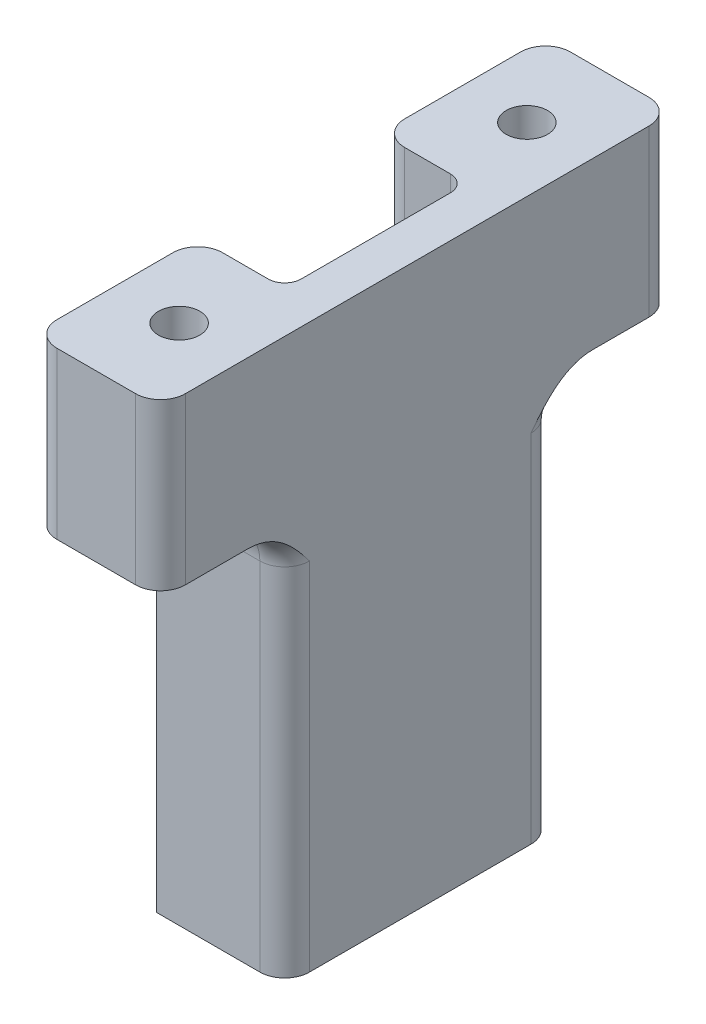
ISO-10303-21;
HEADER;
FILE_DESCRIPTION(('STEP AP214'),'2;1');
FILE_NAME('part.step','',(''),(''),'','','');
FILE_SCHEMA(('AUTOMOTIVE_DESIGN { 1 0 10303 214 1 1 1 1 }'));
ENDSEC;
DATA;
#1=APPLICATION_CONTEXT('core data for automotive mechanical design processes');
#2=APPLICATION_PROTOCOL_DEFINITION('international standard','automotive_design',2000,#1);
#3=PRODUCT_CONTEXT('',#1,'mechanical');
#4=PRODUCT('Part','Part','',(#3));
#5=PRODUCT_RELATED_PRODUCT_CATEGORY('part','',(#4));
#6=PRODUCT_DEFINITION_FORMATION('','',#4);
#7=PRODUCT_DEFINITION_CONTEXT('part definition',#1,'design');
#8=PRODUCT_DEFINITION('design','',#6,#7);
#9=PRODUCT_DEFINITION_SHAPE('','',#8);
#10=(LENGTH_UNIT() NAMED_UNIT(*) SI_UNIT(.MILLI.,.METRE.));
#11=(NAMED_UNIT(*) PLANE_ANGLE_UNIT() SI_UNIT($,.RADIAN.));
#12=(NAMED_UNIT(*) SI_UNIT($,.STERADIAN.) SOLID_ANGLE_UNIT());
#13=UNCERTAINTY_MEASURE_WITH_UNIT(LENGTH_MEASURE(1.E-05),#10,'distance_accuracy_value','');
#14=(GEOMETRIC_REPRESENTATION_CONTEXT(3) GLOBAL_UNCERTAINTY_ASSIGNED_CONTEXT((#13)) GLOBAL_UNIT_ASSIGNED_CONTEXT((#10,
#11,#12)) REPRESENTATION_CONTEXT('',''));
#15=CARTESIAN_POINT('',(0.,0.,0.));
#16=DIRECTION('',(0.,0.,1.));
#17=DIRECTION('',(1.,0.,0.));
#18=AXIS2_PLACEMENT_3D('',#15,#16,#17);
#19=CARTESIAN_POINT('',(0.,0.,0.));
#20=DIRECTION('',(0.,-1.,0.));
#21=DIRECTION('',(0.,0.,-1.));
#22=AXIS2_PLACEMENT_3D('',#19,#20,#21);
#23=PLANE('',#22);
#24=CARTESIAN_POINT('',(-0.380000000000774,0.,-20.6299999999947));
#25=DIRECTION('',(0.,1.,0.));
#26=DIRECTION('',(0.,0.,1.));
#27=AXIS2_PLACEMENT_3D('',#24,#25,#26);
#28=CIRCLE('',#27,2.49999999999999);
#29=CARTESIAN_POINT('',(-0.380000000000774,0.,-18.1299999999947));
#30=VERTEX_POINT('',#29);
#31=EDGE_CURVE('E233',#30,#30,#28,.T.);
#32=ORIENTED_EDGE('',*,*,#31,.F.);
#33=EDGE_LOOP('',(#32));
#34=FACE_BOUND('',#33,.T.);
#35=DIRECTION('',(0.,0.,1.));
#36=VECTOR('',#35,1.);
#37=CARTESIAN_POINT('',(-8.13000000000111,0.,31.370000000004));
#38=LINE('',#37,#36);
#39=CARTESIAN_POINT('',(-8.13000000000111,0.,-27.6299999999959));
#40=VERTEX_POINT('',#39);
#41=CARTESIAN_POINT('',(-8.13000000000055,0.,-13.6299999999935));
#42=VERTEX_POINT('',#41);
#43=EDGE_CURVE('E362',#40,#42,#38,.T.);
#44=ORIENTED_EDGE('',*,*,#43,.T.);
#45=CARTESIAN_POINT('',(-5.13000000000055,0.,-13.6299999999935));
#46=DIRECTION('',(0.,-1.,0.));
#47=DIRECTION('',(0.,0.,1.));
#48=AXIS2_PLACEMENT_3D('',#45,#46,#47);
#49=CIRCLE('',#48,3.);
#50=CARTESIAN_POINT('',(-5.13000000000055,0.,-10.6299999999935));
#51=VERTEX_POINT('',#50);
#52=EDGE_CURVE('E310',#51,#42,#49,.T.);
#53=ORIENTED_EDGE('',*,*,#52,.F.);
#54=DIRECTION('',(-1.,0.,0.));
#55=VECTOR('',#54,1.);
#56=CARTESIAN_POINT('',(-5.13000000000055,0.,-10.6299999999935));
#57=LINE('',#56,#55);
#58=CARTESIAN_POINT('',(0.369999999999482,0.,-10.6299999999936));
#59=VERTEX_POINT('',#58);
#60=EDGE_CURVE('E327',#59,#51,#57,.T.);
#61=ORIENTED_EDGE('',*,*,#60,.F.);
#62=CARTESIAN_POINT('',(0.36999999999951,0.,-8.62999999999356));
#63=DIRECTION('',(0.,1.,0.));
#64=DIRECTION('',(0.,0.,1.));
#65=AXIS2_PLACEMENT_3D('',#62,#63,#64);
#66=CIRCLE('',#65,2.);
#67=CARTESIAN_POINT('',(2.36999999999951,0.,-8.62999999999358));
#68=VERTEX_POINT('',#67);
#69=EDGE_CURVE('E324',#68,#59,#66,.T.);
#70=ORIENTED_EDGE('',*,*,#69,.F.);
#71=DIRECTION('',(0.,0.,-1.));
#72=VECTOR('',#71,1.);
#73=CARTESIAN_POINT('',(2.36999999999951,0.,-8.62999999999358));
#74=LINE('',#73,#72);
#75=CARTESIAN_POINT('',(2.36999999999971,0.,9.37000000000642));
#76=VERTEX_POINT('',#75);
#77=EDGE_CURVE('E321',#76,#68,#74,.T.);
#78=ORIENTED_EDGE('',*,*,#77,.F.);
#79=CARTESIAN_POINT('',(0.369999999999704,0.,9.37000000000644));
#80=DIRECTION('',(0.,1.,0.));
#81=DIRECTION('',(0.,0.,1.));
#82=AXIS2_PLACEMENT_3D('',#79,#80,#81);
#83=CIRCLE('',#82,2.);
#84=CARTESIAN_POINT('',(0.369999999999704,0.,11.3700000000064));
#85=VERTEX_POINT('',#84);
#86=EDGE_CURVE('E318',#85,#76,#83,.T.);
#87=ORIENTED_EDGE('',*,*,#86,.F.);
#88=DIRECTION('',(1.,0.,0.));
#89=VECTOR('',#88,1.);
#90=CARTESIAN_POINT('',(0.369999999999704,0.,11.3700000000064));
#91=LINE('',#90,#89);
#92=CARTESIAN_POINT('',(-5.1300000000003,0.,11.3700000000065));
#93=VERTEX_POINT('',#92);
#94=EDGE_CURVE('E315',#93,#85,#91,.T.);
#95=ORIENTED_EDGE('',*,*,#94,.F.);
#96=CARTESIAN_POINT('',(-5.13000000000027,0.,14.3700000000065));
#97=DIRECTION('',(0.,-1.,0.));
#98=DIRECTION('',(0.,0.,1.));
#99=AXIS2_PLACEMENT_3D('',#96,#97,#98);
#100=CIRCLE('',#99,3.);
#101=CARTESIAN_POINT('',(-8.13000000000111,0.,14.3700000000065));
#102=VERTEX_POINT('',#101);
#103=EDGE_CURVE('E312',#102,#93,#100,.T.);
#104=ORIENTED_EDGE('',*,*,#103,.F.);
#105=CARTESIAN_POINT('',(-8.13000000000111,0.,28.370000000004));
#106=VERTEX_POINT('',#105);
#107=EDGE_CURVE('E361',#102,#106,#38,.T.);
#108=ORIENTED_EDGE('',*,*,#107,.T.);
#109=CARTESIAN_POINT('',(-5.13000000000111,0.,28.370000000004));
#110=DIRECTION('',(0.,-1.,0.));
#111=DIRECTION('',(0.,0.,-1.));
#112=AXIS2_PLACEMENT_3D('',#109,#110,#111);
#113=CIRCLE('',#112,3.);
#114=CARTESIAN_POINT('',(-5.13000000000111,0.,31.370000000004));
#115=VERTEX_POINT('',#114);
#116=EDGE_CURVE('E373',#106,#115,#113,.F.);
#117=ORIENTED_EDGE('',*,*,#116,.T.);
#118=DIRECTION('',(1.,0.,0.));
#119=VECTOR('',#118,1.);
#120=CARTESIAN_POINT('',(-8.13000000000111,0.,31.370000000004));
#121=LINE('',#120,#119);
#122=CARTESIAN_POINT('',(4.36999999999956,0.,31.370000000004));
#123=VERTEX_POINT('',#122);
#124=EDGE_CURVE('E352',#115,#123,#121,.T.);
#125=ORIENTED_EDGE('',*,*,#124,.T.);
#126=CARTESIAN_POINT('',(4.36999999999956,0.,28.370000000004));
#127=DIRECTION('',(0.,-1.,0.));
#128=DIRECTION('',(0.,0.,-1.));
#129=AXIS2_PLACEMENT_3D('',#126,#127,#128);
#130=CIRCLE('',#129,3.);
#131=CARTESIAN_POINT('',(7.36999999999956,0.,28.370000000004));
#132=VERTEX_POINT('',#131);
#133=EDGE_CURVE('E371',#123,#132,#130,.F.);
#134=ORIENTED_EDGE('',*,*,#133,.T.);
#135=DIRECTION('',(0.,0.,-1.));
#136=VECTOR('',#135,1.);
#137=CARTESIAN_POINT('',(7.36999999999956,0.,31.370000000004));
#138=LINE('',#137,#136);
#139=CARTESIAN_POINT('',(7.36999999999956,0.,-27.6299999999959));
#140=VERTEX_POINT('',#139);
#141=EDGE_CURVE('E333',#132,#140,#138,.T.);
#142=ORIENTED_EDGE('',*,*,#141,.T.);
#143=CARTESIAN_POINT('',(4.36999999999956,0.,-27.6299999999959));
#144=DIRECTION('',(0.,-1.,0.));
#145=DIRECTION('',(0.,0.,-1.));
#146=AXIS2_PLACEMENT_3D('',#143,#144,#145);
#147=CIRCLE('',#146,3.);
#148=CARTESIAN_POINT('',(4.36999999999956,0.,-30.6299999999959));
#149=VERTEX_POINT('',#148);
#150=EDGE_CURVE('E375',#140,#149,#147,.F.);
#151=ORIENTED_EDGE('',*,*,#150,.T.);
#152=DIRECTION('',(-1.,0.,0.));
#153=VECTOR('',#152,1.);
#154=CARTESIAN_POINT('',(-8.13000000000111,0.,-30.6299999999959));
#155=LINE('',#154,#153);
#156=CARTESIAN_POINT('',(-5.13000000000111,0.,-30.6299999999959));
#157=VERTEX_POINT('',#156);
#158=EDGE_CURVE('E358',#149,#157,#155,.T.);
#159=ORIENTED_EDGE('',*,*,#158,.T.);
#160=CARTESIAN_POINT('',(-5.13000000000111,0.,-27.6299999999959));
#161=DIRECTION('',(0.,-1.,0.));
#162=DIRECTION('',(0.,0.,-1.));
#163=AXIS2_PLACEMENT_3D('',#160,#161,#162);
#164=CIRCLE('',#163,3.);
#165=EDGE_CURVE('E377',#157,#40,#164,.F.);
#166=ORIENTED_EDGE('',*,*,#165,.T.);
#167=EDGE_LOOP('',(#44,#53,#61,#70,#78,#87,#95,#104,#108,#117,#125,#134,#142,#151,#159,#166));
#168=FACE_BOUND('',#167,.T.);
#169=CARTESIAN_POINT('',(-0.380000000000768,0.,21.3700000000052));
#170=DIRECTION('',(0.,1.,0.));
#171=DIRECTION('',(0.,0.,1.));
#172=AXIS2_PLACEMENT_3D('',#169,#170,#171);
#173=CIRCLE('',#172,2.49999999999999);
#174=CARTESIAN_POINT('',(-0.380000000000768,0.,23.8700000000052));
#175=VERTEX_POINT('',#174);
#176=EDGE_CURVE('E232',#175,#175,#173,.T.);
#177=ORIENTED_EDGE('',*,*,#176,.F.);
#178=EDGE_LOOP('',(#177));
#179=FACE_BOUND('',#178,.T.);
#180=ADVANCED_FACE('F49',(#34,#168,#179),#23,.F.);
#181=CARTESIAN_POINT('',(7.36999999999956,-68.,31.370000000004));
#182=DIRECTION('',(1.,0.,0.));
#183=DIRECTION('',(0.,0.,-1.));
#184=AXIS2_PLACEMENT_3D('',#181,#182,#183);
#185=PLANE('',#184);
#186=DIRECTION('',(0.,0.,-1.));
#187=VECTOR('',#186,1.);
#188=CARTESIAN_POINT('',(7.36999999999956,-68.,31.370000000004));
#189=LINE('',#188,#187);
#190=CARTESIAN_POINT('',(7.36999999999938,-68.,13.370000000004));
#191=VERTEX_POINT('',#190);
#192=CARTESIAN_POINT('',(7.36999999999938,-68.,-13.370000000004));
#193=VERTEX_POINT('',#192);
#194=EDGE_CURVE('E348',#191,#193,#189,.T.);
#195=ORIENTED_EDGE('',*,*,#194,.T.);
#196=DIRECTION('',(0.,-1.,0.));
#197=VECTOR('',#196,1.);
#198=CARTESIAN_POINT('',(7.36999999999938,3.75394704043988,-13.370000000004));
#199=LINE('',#198,#197);
#200=CARTESIAN_POINT('',(7.36999999999938,-25.,-13.370000000004));
#201=VERTEX_POINT('',#200);
#202=EDGE_CURVE('E256',#201,#193,#199,.T.);
#203=ORIENTED_EDGE('',*,*,#202,.F.);
#204=CARTESIAN_POINT('',(7.36999999999947,-20.,-20.7861984870996));
#205=CARTESIAN_POINT('',(7.36999999999952,-19.999975273095,-20.61568528441));
#206=CARTESIAN_POINT('',(7.36999999999955,-20.0074935365838,-20.4452210422768));
#207=CARTESIAN_POINT('',(7.36999999999957,-20.036980049552,-20.105690824079));
#208=CARTESIAN_POINT('',(7.36999999999956,-20.0589355674421,-19.9366237488052));
#209=CARTESIAN_POINT('',(7.36999999999956,-20.1164639689542,-19.6020399618028));
#210=CARTESIAN_POINT('',(7.36999999999956,-20.1519420270762,-19.4365068175846));
#211=CARTESIAN_POINT('',(7.36999999999956,-20.2357731756868,-19.1087025047391));
#212=CARTESIAN_POINT('',(7.36999999999956,-20.2841301293666,-18.9464323306157));
#213=CARTESIAN_POINT('',(7.36999999999956,-20.4069214648221,-18.5846234537346));
#214=CARTESIAN_POINT('',(7.36999999999956,-20.4848649968072,-18.3862710713222));
#215=CARTESIAN_POINT('',(7.36999999999956,-20.6579850711179,-17.997249131493));
#216=CARTESIAN_POINT('',(7.36999999999956,-20.7531650661009,-17.8065811227145));
#217=CARTESIAN_POINT('',(7.36999999999956,-20.9589846922658,-17.4334220282964));
#218=CARTESIAN_POINT('',(7.36999999999956,-21.0696489080713,-17.250944567698));
#219=CARTESIAN_POINT('',(7.36999999999956,-21.30439320074,-16.8947740394538));
#220=CARTESIAN_POINT('',(7.36999999999956,-21.4284787062645,-16.7210845683928));
#221=CARTESIAN_POINT('',(7.36999999999956,-21.6768777004584,-16.3971148286885));
#222=CARTESIAN_POINT('',(7.36999999999956,-21.8002489741779,-16.246107443196));
#223=CARTESIAN_POINT('',(7.36999999999955,-22.0551167288309,-15.9510870646974));
#224=CARTESIAN_POINT('',(7.36999999999954,-22.1866151087736,-15.8070757205588));
#225=CARTESIAN_POINT('',(7.36999999999959,-22.5914536855793,-15.3845394799475));
#226=CARTESIAN_POINT('',(7.36999999999972,-22.8749495256254,-15.1157502649184));
#227=CARTESIAN_POINT('',(7.36999999999939,-23.4594492170119,-14.5969875936539));
#228=CARTESIAN_POINT('',(7.36999999999892,-23.760494826496,-14.3470625561483));
#229=CARTESIAN_POINT('',(7.37000000000019,-24.3706229288083,-13.8576217580581));
#230=CARTESIAN_POINT('',(7.37000000000193,-24.6797026839709,-13.6181025240875));
#231=CARTESIAN_POINT('',(7.36999999999953,-24.9925464416567,-13.3757735004658));
#232=CARTESIAN_POINT('',(7.3699999999995,-24.9962732216537,-13.3728867490946));
#233=CARTESIAN_POINT('',(7.36999999999947,-25.,-13.370000000004));
#234=B_SPLINE_CURVE_WITH_KNOTS('',3,(#204,#205,#206,#207,#208,#209,#210,#211,#212,#213,#214,
#215,#216,#217,#218,#219,#220,#221,#222,#223,#224,#225,#226,#227,#228,#229,#230,#231,#232,#233),
.UNSPECIFIED.,.F.,.F.,(4,2,2,2,2,2,2,2,2,2,2,2,2,2,4),(0.,0.511301398020987,1.02215250508978,
1.52948533158812,2.0369705108664,2.67538958451856,3.31393668242884,3.95350936869953,
4.59334172451234,5.17800417114571,5.76280375244944,6.93330785206522,8.10672075516194,
9.27973892354683,9.29388105917068),.UNSPECIFIED.);
#235=CARTESIAN_POINT('',(7.36999999999947,-20.,-20.7861984870996));
#236=VERTEX_POINT('',#235);
#237=EDGE_CURVE('E414',#201,#236,#234,.F.);
#238=ORIENTED_EDGE('',*,*,#237,.T.);
#239=DIRECTION('',(0.,0.,-1.));
#240=VECTOR('',#239,1.);
#241=CARTESIAN_POINT('',(7.36999999999956,-20.,-28.370000000004));
#242=LINE('',#241,#240);
#243=CARTESIAN_POINT('',(7.36999999999955,-20.,-27.6299999999958));
#244=VERTEX_POINT('',#243);
#245=EDGE_CURVE('E243',#236,#244,#242,.T.);
#246=ORIENTED_EDGE('',*,*,#245,.T.);
#247=DIRECTION('',(0.,1.,0.));
#248=VECTOR('',#247,1.);
#249=CARTESIAN_POINT('',(7.36999999999956,-68.,-27.6299999999959));
#250=LINE('',#249,#248);
#251=EDGE_CURVE('E387',#244,#140,#250,.T.);
#252=ORIENTED_EDGE('',*,*,#251,.T.);
#253=ORIENTED_EDGE('',*,*,#141,.F.);
#254=DIRECTION('',(0.,1.,0.));
#255=VECTOR('',#254,1.);
#256=CARTESIAN_POINT('',(7.36999999999956,-68.,28.370000000004));
#257=LINE('',#256,#255);
#258=CARTESIAN_POINT('',(7.36999999999956,-20.,28.370000000004));
#259=VERTEX_POINT('',#258);
#260=EDGE_CURVE('E384',#132,#259,#257,.F.);
#261=ORIENTED_EDGE('',*,*,#260,.T.);
#262=DIRECTION('',(0.,0.,1.));
#263=VECTOR('',#262,1.);
#264=CARTESIAN_POINT('',(7.36999999999956,-20.,28.370000000004));
#265=LINE('',#264,#263);
#266=CARTESIAN_POINT('',(7.36999999999947,-20.,20.7861984870996));
#267=VERTEX_POINT('',#266);
#268=EDGE_CURVE('E267',#267,#259,#265,.T.);
#269=ORIENTED_EDGE('',*,*,#268,.F.);
#270=CARTESIAN_POINT('',(7.36999999999947,-20.,20.7861984870996));
#271=CARTESIAN_POINT('',(7.36999999999952,-19.999975273095,20.61568528441));
#272=CARTESIAN_POINT('',(7.36999999999955,-20.0074935365838,20.4452210422768));
#273=CARTESIAN_POINT('',(7.36999999999957,-20.036980049552,20.105690824079));
#274=CARTESIAN_POINT('',(7.36999999999956,-20.0589355674421,19.9366237488052));
#275=CARTESIAN_POINT('',(7.36999999999956,-20.1164639689542,19.6020399618028));
#276=CARTESIAN_POINT('',(7.36999999999956,-20.1519420270762,19.4365068175846));
#277=CARTESIAN_POINT('',(7.36999999999956,-20.2357731756868,19.1087025047391));
#278=CARTESIAN_POINT('',(7.36999999999956,-20.2841301293666,18.9464323306157));
#279=CARTESIAN_POINT('',(7.36999999999956,-20.4069214648221,18.5846234537346));
#280=CARTESIAN_POINT('',(7.36999999999956,-20.4848649968072,18.3862710713222));
#281=CARTESIAN_POINT('',(7.36999999999956,-20.6579850711179,17.997249131493));
#282=CARTESIAN_POINT('',(7.36999999999956,-20.7531650661009,17.8065811227145));
#283=CARTESIAN_POINT('',(7.36999999999956,-20.9589846922658,17.4334220282964));
#284=CARTESIAN_POINT('',(7.36999999999956,-21.0696489080713,17.250944567698));
#285=CARTESIAN_POINT('',(7.36999999999956,-21.30439320074,16.8947740394538));
#286=CARTESIAN_POINT('',(7.36999999999956,-21.4284787062645,16.7210845683928));
#287=CARTESIAN_POINT('',(7.36999999999956,-21.6768777004584,16.3971148286885));
#288=CARTESIAN_POINT('',(7.36999999999956,-21.8002489741779,16.246107443196));
#289=CARTESIAN_POINT('',(7.36999999999955,-22.0551167288309,15.9510870646974));
#290=CARTESIAN_POINT('',(7.36999999999954,-22.1866151087736,15.8070757205588));
#291=CARTESIAN_POINT('',(7.36999999999959,-22.5914536855793,15.3845394799475));
#292=CARTESIAN_POINT('',(7.36999999999972,-22.8749495256254,15.1157502649184));
#293=CARTESIAN_POINT('',(7.36999999999939,-23.4594492170119,14.5969875936539));
#294=CARTESIAN_POINT('',(7.36999999999892,-23.760494826496,14.3470625561483));
#295=CARTESIAN_POINT('',(7.37000000000019,-24.3706229288083,13.8576217580581));
#296=CARTESIAN_POINT('',(7.37000000000193,-24.6797026839709,13.6181025240875));
#297=CARTESIAN_POINT('',(7.36999999999953,-24.9925464416567,13.3757735004658));
#298=CARTESIAN_POINT('',(7.3699999999995,-24.9962732216537,13.3728867490946));
#299=CARTESIAN_POINT('',(7.36999999999947,-25.,13.370000000004));
#300=B_SPLINE_CURVE_WITH_KNOTS('',3,(#270,#271,#272,#273,#274,#275,#276,#277,#278,#279,#280,
#281,#282,#283,#284,#285,#286,#287,#288,#289,#290,#291,#292,#293,#294,#295,#296,#297,#298,#299),
.UNSPECIFIED.,.F.,.F.,(4,2,2,2,2,2,2,2,2,2,2,2,2,2,4),(0.,0.511301398020987,1.02215250508978,
1.52948533158812,2.0369705108664,2.67538958451856,3.31393668242884,3.95350936869953,
4.59334172451234,5.17800417114571,5.76280375244944,6.93330785206522,8.10672075516194,
9.27973892354683,9.29388105917068),.UNSPECIFIED.);
#301=CARTESIAN_POINT('',(7.36999999999938,-25.,13.370000000004));
#302=VERTEX_POINT('',#301);
#303=EDGE_CURVE('E422',#267,#302,#300,.T.);
#304=ORIENTED_EDGE('',*,*,#303,.T.);
#305=DIRECTION('',(0.,-1.,0.));
#306=VECTOR('',#305,1.);
#307=CARTESIAN_POINT('',(7.36999999999938,3.75394704043988,13.370000000004));
#308=LINE('',#307,#306);
#309=EDGE_CURVE('E286',#302,#191,#308,.T.);
#310=ORIENTED_EDGE('',*,*,#309,.T.);
#311=EDGE_LOOP('',(#195,#203,#238,#246,#252,#253,#261,#269,#304,#310));
#312=FACE_BOUND('',#311,.T.);
#313=ADVANCED_FACE('F428',(#312),#185,.T.);
#314=CARTESIAN_POINT('',(-8.13000000000111,-68.,-30.6299999999959));
#315=DIRECTION('',(0.,0.,-1.));
#316=DIRECTION('',(-1.,0.,0.));
#317=AXIS2_PLACEMENT_3D('',#314,#315,#316);
#318=PLANE('',#317);
#319=DIRECTION('',(0.,1.,0.));
#320=VECTOR('',#319,1.);
#321=CARTESIAN_POINT('',(4.36999999999956,-68.,-30.6299999999959));
#322=LINE('',#321,#320);
#323=CARTESIAN_POINT('',(4.36999999999956,-20.,-30.6299999999959));
#324=VERTEX_POINT('',#323);
#325=EDGE_CURVE('E355',#149,#324,#322,.F.);
#326=ORIENTED_EDGE('',*,*,#325,.T.);
#327=DIRECTION('',(-1.,0.,0.));
#328=VECTOR('',#327,1.);
#329=CARTESIAN_POINT('',(-8.13000000000111,-20.,-30.6299999999959));
#330=LINE('',#329,#328);
#331=CARTESIAN_POINT('',(-5.13000000000111,-20.,-30.6299999999959));
#332=VERTEX_POINT('',#331);
#333=EDGE_CURVE('E248',#324,#332,#330,.T.);
#334=ORIENTED_EDGE('',*,*,#333,.T.);
#335=DIRECTION('',(0.,1.,0.));
#336=VECTOR('',#335,1.);
#337=CARTESIAN_POINT('',(-5.13000000000111,-68.,-30.6299999999959));
#338=LINE('',#337,#336);
#339=EDGE_CURVE('E369',#332,#157,#338,.T.);
#340=ORIENTED_EDGE('',*,*,#339,.T.);
#341=ORIENTED_EDGE('',*,*,#158,.F.);
#342=EDGE_LOOP('',(#326,#334,#340,#341));
#343=FACE_BOUND('',#342,.T.);
#344=ADVANCED_FACE('F464',(#343),#318,.T.);
#345=CARTESIAN_POINT('',(-5.13000000000111,-68.,-27.6299999999959));
#346=DIRECTION('',(0.,1.,0.));
#347=DIRECTION('',(0.,0.,1.));
#348=AXIS2_PLACEMENT_3D('',#345,#346,#347);
#349=CYLINDRICAL_SURFACE('',#348,3.);
#350=ORIENTED_EDGE('',*,*,#339,.F.);
#351=CARTESIAN_POINT('',(-5.13000000000111,-20.,-27.6299999999959));
#352=DIRECTION('',(0.,-1.,0.));
#353=DIRECTION('',(0.,0.,-1.));
#354=AXIS2_PLACEMENT_3D('',#351,#352,#353);
#355=CIRCLE('',#354,3.);
#356=CARTESIAN_POINT('',(-8.13000000000108,-20.,-27.6299999999958));
#357=VERTEX_POINT('',#356);
#358=EDGE_CURVE('E263',#332,#357,#355,.F.);
#359=ORIENTED_EDGE('',*,*,#358,.T.);
#360=DIRECTION('',(0.,1.,0.));
#361=VECTOR('',#360,1.);
#362=CARTESIAN_POINT('',(-8.13000000000111,-68.,-27.6299999999959));
#363=LINE('',#362,#361);
#364=EDGE_CURVE('E381',#40,#357,#363,.F.);
#365=ORIENTED_EDGE('',*,*,#364,.F.);
#366=ORIENTED_EDGE('',*,*,#165,.F.);
#367=EDGE_LOOP('',(#350,#359,#365,#366));
#368=FACE_BOUND('',#367,.T.);
#369=ADVANCED_FACE('F481',(#368),#349,.T.);
#370=CARTESIAN_POINT('',(4.36999999999956,-68.,-27.6299999999959));
#371=DIRECTION('',(0.,1.,0.));
#372=DIRECTION('',(0.,0.,1.));
#373=AXIS2_PLACEMENT_3D('',#370,#371,#372);
#374=CYLINDRICAL_SURFACE('',#373,3.);
#375=ORIENTED_EDGE('',*,*,#251,.F.);
#376=CARTESIAN_POINT('',(4.36999999999956,-20.,-27.6299999999959));
#377=DIRECTION('',(0.,-1.,0.));
#378=DIRECTION('',(0.,0.,-1.));
#379=AXIS2_PLACEMENT_3D('',#376,#377,#378);
#380=CIRCLE('',#379,3.);
#381=EDGE_CURVE('E394',#244,#324,#380,.F.);
#382=ORIENTED_EDGE('',*,*,#381,.T.);
#383=ORIENTED_EDGE('',*,*,#325,.F.);
#384=ORIENTED_EDGE('',*,*,#150,.F.);
#385=EDGE_LOOP('',(#375,#382,#383,#384));
#386=FACE_BOUND('',#385,.T.);
#387=ADVANCED_FACE('F487',(#386),#374,.T.);
#388=CARTESIAN_POINT('',(-8.13000000000111,-68.,31.370000000004));
#389=DIRECTION('',(-1.,0.,0.));
#390=DIRECTION('',(0.,0.,1.));
#391=AXIS2_PLACEMENT_3D('',#388,#389,#390);
#392=PLANE('',#391);
#393=DIRECTION('',(0.,0.,1.));
#394=VECTOR('',#393,1.);
#395=CARTESIAN_POINT('',(-8.13000000000111,-68.,31.370000000004));
#396=LINE('',#395,#394);
#397=CARTESIAN_POINT('',(-8.13000000000028,-68.,14.3700000000065));
#398=VERTEX_POINT('',#397);
#399=CARTESIAN_POINT('',(-8.13000000000064,-68.,16.3700000000041));
#400=VERTEX_POINT('',#399);
#401=EDGE_CURVE('E351',#398,#400,#396,.T.);
#402=ORIENTED_EDGE('',*,*,#401,.T.);
#403=DIRECTION('',(0.,-1.,0.));
#404=VECTOR('',#403,1.);
#405=CARTESIAN_POINT('',(-8.13000000000064,3.75394704043988,16.3700000000041));
#406=LINE('',#405,#404);
#407=CARTESIAN_POINT('',(-8.13000000000064,-25.,16.3700000000041));
#408=VERTEX_POINT('',#407);
#409=EDGE_CURVE('E282',#408,#400,#406,.T.);
#410=ORIENTED_EDGE('',*,*,#409,.F.);
#411=CARTESIAN_POINT('',(-8.13000000000111,-25.,21.3700000000041));
#412=DIRECTION('',(-1.,0.,0.));
#413=DIRECTION('',(0.,0.,1.));
#414=AXIS2_PLACEMENT_3D('',#411,#412,#413);
#415=CIRCLE('',#414,5.);
#416=CARTESIAN_POINT('',(-8.13000000000083,-20.,21.3700000000041));
#417=VERTEX_POINT('',#416);
#418=EDGE_CURVE('E11',#408,#417,#415,.F.);
#419=ORIENTED_EDGE('',*,*,#418,.T.);
#420=DIRECTION('',(0.,0.,-1.));
#421=VECTOR('',#420,1.);
#422=CARTESIAN_POINT('',(-8.13000000000064,-20.,16.3700000000041));
#423=LINE('',#422,#421);
#424=CARTESIAN_POINT('',(-8.13000000000111,-20.,28.370000000004));
#425=VERTEX_POINT('',#424);
#426=EDGE_CURVE('E270',#425,#417,#423,.T.);
#427=ORIENTED_EDGE('',*,*,#426,.F.);
#428=DIRECTION('',(0.,1.,0.));
#429=VECTOR('',#428,1.);
#430=CARTESIAN_POINT('',(-8.13000000000111,-68.,28.370000000004));
#431=LINE('',#430,#429);
#432=EDGE_CURVE('E379',#425,#106,#431,.T.);
#433=ORIENTED_EDGE('',*,*,#432,.T.);
#434=ORIENTED_EDGE('',*,*,#107,.F.);
#435=DIRECTION('',(0.,1.,0.));
#436=VECTOR('',#435,1.);
#437=CARTESIAN_POINT('',(-8.13000000000028,-68.001,14.3700000000065));
#438=LINE('',#437,#436);
#439=EDGE_CURVE('E344',#398,#102,#438,.T.);
#440=ORIENTED_EDGE('',*,*,#439,.F.);
#441=EDGE_LOOP('',(#402,#410,#419,#427,#433,#434,#440));
#442=FACE_BOUND('',#441,.T.);
#443=ADVANCED_FACE('F476',(#442),#392,.T.);
#444=CARTESIAN_POINT('',(-8.13000000000111,-68.,31.370000000004));
#445=DIRECTION('',(0.,0.,1.));
#446=DIRECTION('',(1.,0.,0.));
#447=AXIS2_PLACEMENT_3D('',#444,#445,#446);
#448=PLANE('',#447);
#449=DIRECTION('',(0.,1.,0.));
#450=VECTOR('',#449,1.);
#451=CARTESIAN_POINT('',(-5.13000000000111,-68.,31.370000000004));
#452=LINE('',#451,#450);
#453=CARTESIAN_POINT('',(-5.13000000000111,-20.,31.370000000004));
#454=VERTEX_POINT('',#453);
#455=EDGE_CURVE('E391',#115,#454,#452,.F.);
#456=ORIENTED_EDGE('',*,*,#455,.T.);
#457=DIRECTION('',(-1.,0.,0.));
#458=VECTOR('',#457,1.);
#459=CARTESIAN_POINT('',(-5.13000000000111,-20.,31.370000000004));
#460=LINE('',#459,#458);
#461=CARTESIAN_POINT('',(4.36999999999956,-20.,31.370000000004));
#462=VERTEX_POINT('',#461);
#463=EDGE_CURVE('E272',#462,#454,#460,.T.);
#464=ORIENTED_EDGE('',*,*,#463,.F.);
#465=DIRECTION('',(0.,1.,0.));
#466=VECTOR('',#465,1.);
#467=CARTESIAN_POINT('',(4.36999999999956,-68.,31.370000000004));
#468=LINE('',#467,#466);
#469=EDGE_CURVE('E389',#462,#123,#468,.T.);
#470=ORIENTED_EDGE('',*,*,#469,.T.);
#471=ORIENTED_EDGE('',*,*,#124,.F.);
#472=EDGE_LOOP('',(#456,#464,#470,#471));
#473=FACE_BOUND('',#472,.T.);
#474=ADVANCED_FACE('F472',(#473),#448,.T.);
#475=CARTESIAN_POINT('',(-5.13000000000111,-68.,28.370000000004));
#476=DIRECTION('',(0.,1.,0.));
#477=DIRECTION('',(0.,0.,1.));
#478=AXIS2_PLACEMENT_3D('',#475,#476,#477);
#479=CYLINDRICAL_SURFACE('',#478,3.);
#480=ORIENTED_EDGE('',*,*,#432,.F.);
#481=CARTESIAN_POINT('',(-5.13000000000111,-20.,28.370000000004));
#482=DIRECTION('',(0.,-1.,0.));
#483=DIRECTION('',(0.,0.,-1.));
#484=AXIS2_PLACEMENT_3D('',#481,#482,#483);
#485=CIRCLE('',#484,3.);
#486=EDGE_CURVE('E274',#454,#425,#485,.T.);
#487=ORIENTED_EDGE('',*,*,#486,.F.);
#488=ORIENTED_EDGE('',*,*,#455,.F.);
#489=ORIENTED_EDGE('',*,*,#116,.F.);
#490=EDGE_LOOP('',(#480,#487,#488,#489));
#491=FACE_BOUND('',#490,.T.);
#492=ADVANCED_FACE('F475',(#491),#479,.T.);
#493=CARTESIAN_POINT('',(4.36999999999956,-68.,28.370000000004));
#494=DIRECTION('',(0.,1.,0.));
#495=DIRECTION('',(0.,0.,1.));
#496=AXIS2_PLACEMENT_3D('',#493,#494,#495);
#497=CYLINDRICAL_SURFACE('',#496,3.);
#498=ORIENTED_EDGE('',*,*,#469,.F.);
#499=CARTESIAN_POINT('',(4.36999999999956,-20.,28.370000000004));
#500=DIRECTION('',(0.,-1.,0.));
#501=DIRECTION('',(0.,0.,-1.));
#502=AXIS2_PLACEMENT_3D('',#499,#500,#501);
#503=CIRCLE('',#502,3.);
#504=EDGE_CURVE('E269',#259,#462,#503,.T.);
#505=ORIENTED_EDGE('',*,*,#504,.F.);
#506=ORIENTED_EDGE('',*,*,#260,.F.);
#507=ORIENTED_EDGE('',*,*,#133,.F.);
#508=EDGE_LOOP('',(#498,#505,#506,#507));
#509=FACE_BOUND('',#508,.T.);
#510=ADVANCED_FACE('F439',(#509),#497,.T.);
#511=DIRECTION('',(0.,0.,1.));
#512=VECTOR('',#511,1.);
#513=CARTESIAN_POINT('',(-8.13000000000064,-20.,-16.3700000000041));
#514=LINE('',#513,#512);
#515=CARTESIAN_POINT('',(-8.13000000000083,-20.,-21.3700000000041));
#516=VERTEX_POINT('',#515);
#517=EDGE_CURVE('E245',#357,#516,#514,.T.);
#518=ORIENTED_EDGE('',*,*,#517,.T.);
#519=CARTESIAN_POINT('',(-8.13000000000111,-25.,-21.3700000000041));
#520=DIRECTION('',(-1.,0.,0.));
#521=DIRECTION('',(0.,0.,1.));
#522=AXIS2_PLACEMENT_3D('',#519,#520,#521);
#523=CIRCLE('',#522,5.);
#524=CARTESIAN_POINT('',(-8.13000000000064,-25.,-16.3700000000041));
#525=VERTEX_POINT('',#524);
#526=EDGE_CURVE('E58',#516,#525,#523,.F.);
#527=ORIENTED_EDGE('',*,*,#526,.T.);
#528=DIRECTION('',(0.,-1.,0.));
#529=VECTOR('',#528,1.);
#530=CARTESIAN_POINT('',(-8.13000000000064,3.75394704043988,-16.3700000000041));
#531=LINE('',#530,#529);
#532=CARTESIAN_POINT('',(-8.13000000000064,-68.,-16.3700000000041));
#533=VERTEX_POINT('',#532);
#534=EDGE_CURVE('E246',#525,#533,#531,.T.);
#535=ORIENTED_EDGE('',*,*,#534,.T.);
#536=CARTESIAN_POINT('',(-8.13000000000111,-68.,-13.6299999999935));
#537=VERTEX_POINT('',#536);
#538=EDGE_CURVE('E353',#533,#537,#396,.T.);
#539=ORIENTED_EDGE('',*,*,#538,.T.);
#540=DIRECTION('',(0.,1.,0.));
#541=VECTOR('',#540,1.);
#542=CARTESIAN_POINT('',(-8.13000000000055,-68.001,-13.6299999999935));
#543=LINE('',#542,#541);
#544=EDGE_CURVE('E330',#537,#42,#543,.T.);
#545=ORIENTED_EDGE('',*,*,#544,.T.);
#546=ORIENTED_EDGE('',*,*,#43,.F.);
#547=ORIENTED_EDGE('',*,*,#364,.T.);
#548=EDGE_LOOP('',(#518,#527,#535,#539,#545,#546,#547));
#549=FACE_BOUND('',#548,.T.);
#550=ADVANCED_FACE('F478',(#549),#392,.T.);
#551=CARTESIAN_POINT('',(0.,-68.,0.));
#552=DIRECTION('',(0.,-1.,0.));
#553=DIRECTION('',(0.,0.,-1.));
#554=AXIS2_PLACEMENT_3D('',#551,#552,#553);
#555=PLANE('',#554);
#556=DIRECTION('',(-1.,0.,0.));
#557=VECTOR('',#556,1.);
#558=CARTESIAN_POINT('',(4.3699999999994,-68.,-16.370000000004));
#559=LINE('',#558,#557);
#560=CARTESIAN_POINT('',(4.3699999999994,-68.,-16.370000000004));
#561=VERTEX_POINT('',#560);
#562=EDGE_CURVE('E249',#561,#533,#559,.T.);
#563=ORIENTED_EDGE('',*,*,#562,.F.);
#564=CARTESIAN_POINT('',(4.36999999999937,-68.,-13.370000000004));
#565=DIRECTION('',(0.,1.,0.));
#566=DIRECTION('',(0.,0.,-1.));
#567=AXIS2_PLACEMENT_3D('',#564,#565,#566);
#568=CIRCLE('',#567,3.00000000000001);
#569=EDGE_CURVE('E252',#193,#561,#568,.T.);
#570=ORIENTED_EDGE('',*,*,#569,.F.);
#571=ORIENTED_EDGE('',*,*,#194,.F.);
#572=CARTESIAN_POINT('',(4.36999999999937,-68.,13.370000000004));
#573=DIRECTION('',(0.,-1.,0.));
#574=DIRECTION('',(0.,0.,1.));
#575=AXIS2_PLACEMENT_3D('',#572,#573,#574);
#576=CIRCLE('',#575,3.00000000000001);
#577=CARTESIAN_POINT('',(4.3699999999994,-68.,16.370000000004));
#578=VERTEX_POINT('',#577);
#579=EDGE_CURVE('E266',#191,#578,#576,.T.);
#580=ORIENTED_EDGE('',*,*,#579,.T.);
#581=DIRECTION('',(-1.,0.,0.));
#582=VECTOR('',#581,1.);
#583=CARTESIAN_POINT('',(4.3699999999994,-68.,16.370000000004));
#584=LINE('',#583,#582);
#585=EDGE_CURVE('E279',#578,#400,#584,.T.);
#586=ORIENTED_EDGE('',*,*,#585,.T.);
#587=ORIENTED_EDGE('',*,*,#401,.F.);
#588=CARTESIAN_POINT('',(-5.13000000000027,-68.,14.3700000000065));
#589=DIRECTION('',(0.,-1.,0.));
#590=DIRECTION('',(0.,0.,-1.));
#591=AXIS2_PLACEMENT_3D('',#588,#589,#590);
#592=CIRCLE('',#591,3.);
#593=CARTESIAN_POINT('',(-5.13000000000027,-68.,11.3700000000065));
#594=VERTEX_POINT('',#593);
#595=EDGE_CURVE('E276',#398,#594,#592,.T.);
#596=ORIENTED_EDGE('',*,*,#595,.T.);
#597=DIRECTION('',(1.,0.,0.));
#598=VECTOR('',#597,1.);
#599=CARTESIAN_POINT('',(0.369999999999704,-68.,11.3700000000064));
#600=LINE('',#599,#598);
#601=CARTESIAN_POINT('',(0.369999999999704,-68.,11.3700000000064));
#602=VERTEX_POINT('',#601);
#603=EDGE_CURVE('E292',#594,#602,#600,.T.);
#604=ORIENTED_EDGE('',*,*,#603,.T.);
#605=CARTESIAN_POINT('',(0.369999999999704,-68.,9.37000000000644));
#606=DIRECTION('',(0.,-1.,0.));
#607=DIRECTION('',(0.,0.,-1.));
#608=AXIS2_PLACEMENT_3D('',#605,#606,#607);
#609=CIRCLE('',#608,2.);
#610=CARTESIAN_POINT('',(2.36999999999971,-68.,9.37000000000642));
#611=VERTEX_POINT('',#610);
#612=EDGE_CURVE('E295',#602,#611,#609,.F.);
#613=ORIENTED_EDGE('',*,*,#612,.T.);
#614=DIRECTION('',(0.,0.,-1.));
#615=VECTOR('',#614,1.);
#616=CARTESIAN_POINT('',(2.36999999999951,-68.,-8.62999999999358));
#617=LINE('',#616,#615);
#618=CARTESIAN_POINT('',(2.36999999999951,-68.,-8.62999999999358));
#619=VERTEX_POINT('',#618);
#620=EDGE_CURVE('E298',#611,#619,#617,.T.);
#621=ORIENTED_EDGE('',*,*,#620,.T.);
#622=CARTESIAN_POINT('',(0.36999999999951,-68.,-8.62999999999356));
#623=DIRECTION('',(0.,-1.,0.));
#624=DIRECTION('',(0.,0.,-1.));
#625=AXIS2_PLACEMENT_3D('',#622,#623,#624);
#626=CIRCLE('',#625,2.);
#627=CARTESIAN_POINT('',(0.36999999999951,-68.,-10.6299999999936));
#628=VERTEX_POINT('',#627);
#629=EDGE_CURVE('E301',#619,#628,#626,.F.);
#630=ORIENTED_EDGE('',*,*,#629,.T.);
#631=DIRECTION('',(-1.,0.,0.));
#632=VECTOR('',#631,1.);
#633=CARTESIAN_POINT('',(-5.13000000000055,-68.,-10.6299999999935));
#634=LINE('',#633,#632);
#635=CARTESIAN_POINT('',(-5.13000000000055,-68.,-10.6299999999935));
#636=VERTEX_POINT('',#635);
#637=EDGE_CURVE('E304',#628,#636,#634,.T.);
#638=ORIENTED_EDGE('',*,*,#637,.T.);
#639=CARTESIAN_POINT('',(-5.13000000000055,-68.,-13.6299999999935));
#640=DIRECTION('',(0.,-1.,0.));
#641=DIRECTION('',(0.,0.,-1.));
#642=AXIS2_PLACEMENT_3D('',#639,#640,#641);
#643=CIRCLE('',#642,3.);
#644=EDGE_CURVE('E307',#636,#537,#643,.T.);
#645=ORIENTED_EDGE('',*,*,#644,.T.);
#646=ORIENTED_EDGE('',*,*,#538,.F.);
#647=EDGE_LOOP('',(#563,#570,#571,#580,#586,#587,#596,#604,#613,#621,#630,#638,#645,#646));
#648=FACE_BOUND('',#647,.T.);
#649=ADVANCED_FACE('F470',(#648),#555,.T.);
#650=CARTESIAN_POINT('',(-5.13000000000055,-68.001,-13.6299999999935));
#651=DIRECTION('',(0.,1.,0.));
#652=DIRECTION('',(0.,0.,1.));
#653=AXIS2_PLACEMENT_3D('',#650,#651,#652);
#654=CYLINDRICAL_SURFACE('',#653,3.);
#655=DIRECTION('',(0.,1.,0.));
#656=VECTOR('',#655,1.);
#657=CARTESIAN_POINT('',(-5.13000000000055,-68.001,-10.6299999999935));
#658=LINE('',#657,#656);
#659=EDGE_CURVE('E331',#636,#51,#658,.T.);
#660=ORIENTED_EDGE('',*,*,#659,.T.);
#661=ORIENTED_EDGE('',*,*,#52,.T.);
#662=ORIENTED_EDGE('',*,*,#544,.F.);
#663=ORIENTED_EDGE('',*,*,#644,.F.);
#664=EDGE_LOOP('',(#660,#661,#662,#663));
#665=FACE_BOUND('',#664,.T.);
#666=ADVANCED_FACE('F553',(#665),#654,.T.);
#667=CARTESIAN_POINT('',(-5.13000000000055,-68.001,-10.6299999999935));
#668=DIRECTION('',(0.,0.,-1.));
#669=DIRECTION('',(-1.,0.,0.));
#670=AXIS2_PLACEMENT_3D('',#667,#668,#669);
#671=PLANE('',#670);
#672=DIRECTION('',(0.,1.,0.));
#673=VECTOR('',#672,1.);
#674=CARTESIAN_POINT('',(0.369999999999482,-68.001,-10.6299999999936));
#675=LINE('',#674,#673);
#676=EDGE_CURVE('E334',#628,#59,#675,.T.);
#677=ORIENTED_EDGE('',*,*,#676,.T.);
#678=ORIENTED_EDGE('',*,*,#60,.T.);
#679=ORIENTED_EDGE('',*,*,#659,.F.);
#680=ORIENTED_EDGE('',*,*,#637,.F.);
#681=EDGE_LOOP('',(#677,#678,#679,#680));
#682=FACE_BOUND('',#681,.T.);
#683=ADVANCED_FACE('F556',(#682),#671,.F.);
#684=CARTESIAN_POINT('',(0.36999999999951,-68.001,-8.62999999999356));
#685=DIRECTION('',(0.,1.,0.));
#686=DIRECTION('',(0.,0.,1.));
#687=AXIS2_PLACEMENT_3D('',#684,#685,#686);
#688=CYLINDRICAL_SURFACE('',#687,2.);
#689=DIRECTION('',(0.,1.,0.));
#690=VECTOR('',#689,1.);
#691=CARTESIAN_POINT('',(2.36999999999951,-68.001,-8.62999999999358));
#692=LINE('',#691,#690);
#693=EDGE_CURVE('E336',#619,#68,#692,.T.);
#694=ORIENTED_EDGE('',*,*,#693,.T.);
#695=ORIENTED_EDGE('',*,*,#69,.T.);
#696=ORIENTED_EDGE('',*,*,#676,.F.);
#697=ORIENTED_EDGE('',*,*,#629,.F.);
#698=EDGE_LOOP('',(#694,#695,#696,#697));
#699=FACE_BOUND('',#698,.T.);
#700=ADVANCED_FACE('F562',(#699),#688,.F.);
#701=CARTESIAN_POINT('',(2.36999999999951,-68.001,-8.62999999999358));
#702=DIRECTION('',(1.,0.,0.));
#703=DIRECTION('',(0.,0.,-1.));
#704=AXIS2_PLACEMENT_3D('',#701,#702,#703);
#705=PLANE('',#704);
#706=DIRECTION('',(0.,1.,0.));
#707=VECTOR('',#706,1.);
#708=CARTESIAN_POINT('',(2.36999999999971,-68.001,9.37000000000642));
#709=LINE('',#708,#707);
#710=EDGE_CURVE('E338',#611,#76,#709,.T.);
#711=ORIENTED_EDGE('',*,*,#710,.T.);
#712=ORIENTED_EDGE('',*,*,#77,.T.);
#713=ORIENTED_EDGE('',*,*,#693,.F.);
#714=ORIENTED_EDGE('',*,*,#620,.F.);
#715=EDGE_LOOP('',(#711,#712,#713,#714));
#716=FACE_BOUND('',#715,.T.);
#717=ADVANCED_FACE('F565',(#716),#705,.F.);
#718=CARTESIAN_POINT('',(0.369999999999704,-68.001,9.37000000000644));
#719=DIRECTION('',(0.,1.,0.));
#720=DIRECTION('',(0.,0.,1.));
#721=AXIS2_PLACEMENT_3D('',#718,#719,#720);
#722=CYLINDRICAL_SURFACE('',#721,2.);
#723=DIRECTION('',(0.,1.,0.));
#724=VECTOR('',#723,1.);
#725=CARTESIAN_POINT('',(0.369999999999704,-68.001,11.3700000000064));
#726=LINE('',#725,#724);
#727=EDGE_CURVE('E340',#602,#85,#726,.T.);
#728=ORIENTED_EDGE('',*,*,#727,.T.);
#729=ORIENTED_EDGE('',*,*,#86,.T.);
#730=ORIENTED_EDGE('',*,*,#710,.F.);
#731=ORIENTED_EDGE('',*,*,#612,.F.);
#732=EDGE_LOOP('',(#728,#729,#730,#731));
#733=FACE_BOUND('',#732,.T.);
#734=ADVANCED_FACE('F568',(#733),#722,.F.);
#735=CARTESIAN_POINT('',(0.369999999999704,-68.001,11.3700000000064));
#736=DIRECTION('',(0.,0.,1.));
#737=DIRECTION('',(1.,0.,0.));
#738=AXIS2_PLACEMENT_3D('',#735,#736,#737);
#739=PLANE('',#738);
#740=DIRECTION('',(0.,1.,0.));
#741=VECTOR('',#740,1.);
#742=CARTESIAN_POINT('',(-5.1300000000003,-68.001,11.3700000000065));
#743=LINE('',#742,#741);
#744=EDGE_CURVE('E342',#594,#93,#743,.T.);
#745=ORIENTED_EDGE('',*,*,#744,.T.);
#746=ORIENTED_EDGE('',*,*,#94,.T.);
#747=ORIENTED_EDGE('',*,*,#727,.F.);
#748=ORIENTED_EDGE('',*,*,#603,.F.);
#749=EDGE_LOOP('',(#745,#746,#747,#748));
#750=FACE_BOUND('',#749,.T.);
#751=ADVANCED_FACE('F573',(#750),#739,.F.);
#752=CARTESIAN_POINT('',(-5.13000000000027,-68.001,14.3700000000065));
#753=DIRECTION('',(0.,1.,0.));
#754=DIRECTION('',(0.,0.,1.));
#755=AXIS2_PLACEMENT_3D('',#752,#753,#754);
#756=CYLINDRICAL_SURFACE('',#755,3.);
#757=ORIENTED_EDGE('',*,*,#439,.T.);
#758=ORIENTED_EDGE('',*,*,#103,.T.);
#759=ORIENTED_EDGE('',*,*,#744,.F.);
#760=ORIENTED_EDGE('',*,*,#595,.F.);
#761=EDGE_LOOP('',(#757,#758,#759,#760));
#762=FACE_BOUND('',#761,.T.);
#763=ADVANCED_FACE('F576',(#762),#756,.T.);
#764=CARTESIAN_POINT('',(4.3699999999994,3.75394704043988,16.370000000004));
#765=DIRECTION('',(0.,0.,1.));
#766=DIRECTION('',(1.,0.,0.));
#767=AXIS2_PLACEMENT_3D('',#764,#765,#766);
#768=PLANE('',#767);
#769=DIRECTION('',(0.,-1.,0.));
#770=VECTOR('',#769,1.);
#771=CARTESIAN_POINT('',(4.3699999999994,3.75394704043988,16.370000000004));
#772=LINE('',#771,#770);
#773=CARTESIAN_POINT('',(4.3699999999994,-25.,16.370000000004));
#774=VERTEX_POINT('',#773);
#775=EDGE_CURVE('E284',#774,#578,#772,.T.);
#776=ORIENTED_EDGE('',*,*,#775,.F.);
#777=DIRECTION('',(1.,0.,0.));
#778=VECTOR('',#777,1.);
#779=CARTESIAN_POINT('',(-8.13000000000064,-25.,16.3700000000041));
#780=LINE('',#779,#778);
#781=EDGE_CURVE('E66',#774,#408,#780,.F.);
#782=ORIENTED_EDGE('',*,*,#781,.T.);
#783=ORIENTED_EDGE('',*,*,#409,.T.);
#784=ORIENTED_EDGE('',*,*,#585,.F.);
#785=EDGE_LOOP('',(#776,#782,#783,#784));
#786=FACE_BOUND('',#785,.T.);
#787=ADVANCED_FACE('F580',(#786),#768,.T.);
#788=CARTESIAN_POINT('',(4.36999999999937,3.75394704043988,13.370000000004));
#789=DIRECTION('',(0.,-1.,0.));
#790=DIRECTION('',(0.,0.,-1.));
#791=AXIS2_PLACEMENT_3D('',#788,#789,#790);
#792=CYLINDRICAL_SURFACE('',#791,3.00000000000001);
#793=ORIENTED_EDGE('',*,*,#309,.F.);
#794=CARTESIAN_POINT('',(4.36999999999937,-25.,13.370000000004));
#795=DIRECTION('',(0.,-1.,0.));
#796=DIRECTION('',(0.,0.,-1.));
#797=AXIS2_PLACEMENT_3D('',#794,#795,#796);
#798=CIRCLE('',#797,3.00000000000001);
#799=EDGE_CURVE('E409',#302,#774,#798,.T.);
#800=ORIENTED_EDGE('',*,*,#799,.T.);
#801=ORIENTED_EDGE('',*,*,#775,.T.);
#802=ORIENTED_EDGE('',*,*,#579,.F.);
#803=EDGE_LOOP('',(#793,#800,#801,#802));
#804=FACE_BOUND('',#803,.T.);
#805=ADVANCED_FACE('F535',(#804),#792,.T.);
#806=CARTESIAN_POINT('',(-27.1300000000003,-20.,2.730000000004));
#807=DIRECTION('',(0.,-1.,0.));
#808=DIRECTION('',(0.,0.,-1.));
#809=AXIS2_PLACEMENT_3D('',#806,#807,#808);
#810=PLANE('',#809);
#811=DIRECTION('',(1.,0.,0.));
#812=VECTOR('',#811,1.);
#813=CARTESIAN_POINT('',(4.36999999999945,-20.,21.370000000004));
#814=LINE('',#813,#812);
#815=CARTESIAN_POINT('',(4.36999999999945,-20.,21.370000000004));
#816=VERTEX_POINT('',#815);
#817=EDGE_CURVE('E404',#417,#816,#814,.T.);
#818=ORIENTED_EDGE('',*,*,#817,.T.);
#819=CARTESIAN_POINT('',(4.36999999999937,-20.,13.370000000004));
#820=DIRECTION('',(0.,-1.,0.));
#821=DIRECTION('',(0.,0.,-1.));
#822=AXIS2_PLACEMENT_3D('',#819,#820,#821);
#823=CIRCLE('',#822,8.00000000000001);
#824=EDGE_CURVE('E406',#816,#267,#823,.F.);
#825=ORIENTED_EDGE('',*,*,#824,.T.);
#826=ORIENTED_EDGE('',*,*,#268,.T.);
#827=ORIENTED_EDGE('',*,*,#504,.T.);
#828=ORIENTED_EDGE('',*,*,#463,.T.);
#829=ORIENTED_EDGE('',*,*,#486,.T.);
#830=ORIENTED_EDGE('',*,*,#426,.T.);
#831=EDGE_LOOP('',(#818,#825,#826,#827,#828,#829,#830));
#832=FACE_BOUND('',#831,.T.);
#833=ADVANCED_FACE('F515',(#832),#810,.T.);
#834=CARTESIAN_POINT('',(4.3699999999994,3.75394704043988,-16.370000000004));
#835=DIRECTION('',(0.,0.,1.));
#836=DIRECTION('',(1.,0.,0.));
#837=AXIS2_PLACEMENT_3D('',#834,#835,#836);
#838=PLANE('',#837);
#839=ORIENTED_EDGE('',*,*,#534,.F.);
#840=DIRECTION('',(1.,0.,0.));
#841=VECTOR('',#840,1.);
#842=CARTESIAN_POINT('',(4.3699999999994,-25.,-16.370000000004));
#843=LINE('',#842,#841);
#844=CARTESIAN_POINT('',(4.3699999999994,-25.,-16.370000000004));
#845=VERTEX_POINT('',#844);
#846=EDGE_CURVE('E411',#525,#845,#843,.T.);
#847=ORIENTED_EDGE('',*,*,#846,.T.);
#848=DIRECTION('',(0.,-1.,0.));
#849=VECTOR('',#848,1.);
#850=CARTESIAN_POINT('',(4.3699999999994,3.75394704043988,-16.370000000004));
#851=LINE('',#850,#849);
#852=EDGE_CURVE('E258',#845,#561,#851,.T.);
#853=ORIENTED_EDGE('',*,*,#852,.T.);
#854=ORIENTED_EDGE('',*,*,#562,.T.);
#855=EDGE_LOOP('',(#839,#847,#853,#854));
#856=FACE_BOUND('',#855,.T.);
#857=ADVANCED_FACE('F544',(#856),#838,.F.);
#858=CARTESIAN_POINT('',(4.36999999999937,3.75394704043988,-13.370000000004));
#859=DIRECTION('',(0.,-1.,0.));
#860=DIRECTION('',(0.,0.,-1.));
#861=AXIS2_PLACEMENT_3D('',#858,#859,#860);
#862=CYLINDRICAL_SURFACE('',#861,3.00000000000001);
#863=ORIENTED_EDGE('',*,*,#852,.F.);
#864=CARTESIAN_POINT('',(4.36999999999937,-25.,-13.370000000004));
#865=DIRECTION('',(0.,-1.,0.));
#866=DIRECTION('',(0.,0.,-1.));
#867=AXIS2_PLACEMENT_3D('',#864,#865,#866);
#868=CIRCLE('',#867,3.00000000000001);
#869=EDGE_CURVE('E397',#845,#201,#868,.T.);
#870=ORIENTED_EDGE('',*,*,#869,.T.);
#871=ORIENTED_EDGE('',*,*,#202,.T.);
#872=ORIENTED_EDGE('',*,*,#569,.T.);
#873=EDGE_LOOP('',(#863,#870,#871,#872));
#874=FACE_BOUND('',#873,.T.);
#875=ADVANCED_FACE('F546',(#874),#862,.T.);
#876=CARTESIAN_POINT('',(-27.1300000000003,-20.,2.730000000004));
#877=DIRECTION('',(0.,-1.,0.));
#878=DIRECTION('',(0.,0.,-1.));
#879=AXIS2_PLACEMENT_3D('',#876,#877,#878);
#880=PLANE('',#879);
#881=ORIENTED_EDGE('',*,*,#245,.F.);
#882=CARTESIAN_POINT('',(4.36999999999937,-20.,-13.370000000004));
#883=DIRECTION('',(0.,-1.,0.));
#884=DIRECTION('',(0.,0.,-1.));
#885=AXIS2_PLACEMENT_3D('',#882,#883,#884);
#886=CIRCLE('',#885,8.00000000000001);
#887=CARTESIAN_POINT('',(4.36999999999945,-20.,-21.370000000004));
#888=VERTEX_POINT('',#887);
#889=EDGE_CURVE('E402',#236,#888,#886,.F.);
#890=ORIENTED_EDGE('',*,*,#889,.T.);
#891=DIRECTION('',(1.,0.,0.));
#892=VECTOR('',#891,1.);
#893=CARTESIAN_POINT('',(-27.1300000000001,-20.,-21.3700000000043));
#894=LINE('',#893,#892);
#895=EDGE_CURVE('E400',#888,#516,#894,.F.);
#896=ORIENTED_EDGE('',*,*,#895,.T.);
#897=ORIENTED_EDGE('',*,*,#517,.F.);
#898=ORIENTED_EDGE('',*,*,#358,.F.);
#899=ORIENTED_EDGE('',*,*,#333,.F.);
#900=ORIENTED_EDGE('',*,*,#381,.F.);
#901=EDGE_LOOP('',(#881,#890,#896,#897,#898,#899,#900));
#902=FACE_BOUND('',#901,.T.);
#903=ADVANCED_FACE('F442',(#902),#880,.T.);
#904=CARTESIAN_POINT('',(4.36999999999945,-25.,-21.370000000004));
#905=DIRECTION('',(1.,0.,0.));
#906=DIRECTION('',(0.,0.,-1.));
#907=AXIS2_PLACEMENT_3D('',#904,#905,#906);
#908=CYLINDRICAL_SURFACE('',#907,5.);
#909=ORIENTED_EDGE('',*,*,#526,.F.);
#910=ORIENTED_EDGE('',*,*,#895,.F.);
#911=CARTESIAN_POINT('',(4.36999999999945,-25.,-21.370000000004));
#912=DIRECTION('',(-1.,0.,0.));
#913=DIRECTION('',(0.,0.,1.));
#914=AXIS2_PLACEMENT_3D('',#911,#912,#913);
#915=CIRCLE('',#914,5.);
#916=EDGE_CURVE('E253',#845,#888,#915,.T.);
#917=ORIENTED_EDGE('',*,*,#916,.F.);
#918=ORIENTED_EDGE('',*,*,#846,.F.);
#919=EDGE_LOOP('',(#909,#910,#917,#918));
#920=FACE_BOUND('',#919,.T.);
#921=ADVANCED_FACE('F437',(#920),#908,.F.);
#922=CARTESIAN_POINT('',(4.36999999999937,-25.,-13.370000000004));
#923=DIRECTION('',(0.,-1.,0.));
#924=DIRECTION('',(0.,0.,-1.));
#925=AXIS2_PLACEMENT_3D('',#922,#923,#924);
#926=TOROIDAL_SURFACE('',#925,8.00000000000001,5.);
#927=ORIENTED_EDGE('',*,*,#916,.T.);
#928=ORIENTED_EDGE('',*,*,#889,.F.);
#929=ORIENTED_EDGE('',*,*,#237,.F.);
#930=ORIENTED_EDGE('',*,*,#869,.F.);
#931=EDGE_LOOP('',(#927,#928,#929,#930));
#932=FACE_BOUND('',#931,.T.);
#933=ADVANCED_FACE('F432',(#932),#926,.F.);
#934=CARTESIAN_POINT('',(-27.1300000000002,-25.,21.3700000000043));
#935=DIRECTION('',(-1.,0.,0.));
#936=DIRECTION('',(0.,0.,1.));
#937=AXIS2_PLACEMENT_3D('',#934,#935,#936);
#938=CYLINDRICAL_SURFACE('',#937,5.);
#939=ORIENTED_EDGE('',*,*,#418,.F.);
#940=ORIENTED_EDGE('',*,*,#781,.F.);
#941=CARTESIAN_POINT('',(4.36999999999945,-25.,21.370000000004));
#942=DIRECTION('',(-1.,0.,0.));
#943=DIRECTION('',(0.,0.,1.));
#944=AXIS2_PLACEMENT_3D('',#941,#942,#943);
#945=CIRCLE('',#944,5.);
#946=EDGE_CURVE('E53',#816,#774,#945,.T.);
#947=ORIENTED_EDGE('',*,*,#946,.F.);
#948=ORIENTED_EDGE('',*,*,#817,.F.);
#949=EDGE_LOOP('',(#939,#940,#947,#948));
#950=FACE_BOUND('',#949,.T.);
#951=ADVANCED_FACE('F51',(#950),#938,.F.);
#952=CARTESIAN_POINT('',(4.36999999999937,-25.,13.370000000004));
#953=DIRECTION('',(0.,-1.,0.));
#954=DIRECTION('',(0.,0.,-1.));
#955=AXIS2_PLACEMENT_3D('',#952,#953,#954);
#956=TOROIDAL_SURFACE('',#955,8.00000000000001,5.);
#957=ORIENTED_EDGE('',*,*,#946,.T.);
#958=ORIENTED_EDGE('',*,*,#799,.F.);
#959=ORIENTED_EDGE('',*,*,#303,.F.);
#960=ORIENTED_EDGE('',*,*,#824,.F.);
#961=EDGE_LOOP('',(#957,#958,#959,#960));
#962=FACE_BOUND('',#961,.T.);
#963=ADVANCED_FACE('F444',(#962),#956,.F.);
#964=CARTESIAN_POINT('',(-0.380000000000768,-15.,21.3700000000052));
#965=DIRECTION('',(0.,1.,0.));
#966=DIRECTION('',(0.,0.,1.));
#967=AXIS2_PLACEMENT_3D('',#964,#965,#966);
#968=CONICAL_SURFACE('',#967,2.49999999999999,1.02974425867665);
#969=CARTESIAN_POINT('',(-0.380000000000772,-16.5021515475689,21.3700000000052));
#970=VERTEX_POINT('',#969);
#971=VERTEX_LOOP('',#970);
#972=FACE_BOUND('',#971,.T.);
#973=CARTESIAN_POINT('',(-0.380000000000768,-15.,21.3700000000052));
#974=DIRECTION('',(0.,1.,0.));
#975=DIRECTION('',(0.,0.,1.));
#976=AXIS2_PLACEMENT_3D('',#973,#974,#975);
#977=CIRCLE('',#976,2.49999999999999);
#978=CARTESIAN_POINT('',(-0.380000000000768,-15.,23.8700000000052));
#979=VERTEX_POINT('',#978);
#980=EDGE_CURVE('E236',#979,#979,#977,.T.);
#981=ORIENTED_EDGE('',*,*,#980,.T.);
#982=EDGE_LOOP('',(#981));
#983=FACE_BOUND('',#982,.T.);
#984=ADVANCED_FACE('F447',(#972,#983),#968,.F.);
#985=CARTESIAN_POINT('',(-0.380000000000768,0.,21.3700000000052));
#986=DIRECTION('',(0.,1.,0.));
#987=DIRECTION('',(0.,0.,1.));
#988=AXIS2_PLACEMENT_3D('',#985,#986,#987);
#989=CYLINDRICAL_SURFACE('',#988,2.49999999999999);
#990=ORIENTED_EDGE('',*,*,#980,.F.);
#991=EDGE_LOOP('',(#990));
#992=FACE_BOUND('',#991,.T.);
#993=ORIENTED_EDGE('',*,*,#176,.T.);
#994=EDGE_LOOP('',(#993));
#995=FACE_BOUND('',#994,.T.);
#996=ADVANCED_FACE('F226',(#992,#995),#989,.F.);
#997=CARTESIAN_POINT('',(-0.380000000000774,-15.,-20.6299999999947));
#998=DIRECTION('',(0.,1.,0.));
#999=DIRECTION('',(0.,0.,1.));
#1000=AXIS2_PLACEMENT_3D('',#997,#998,#999);
#1001=CONICAL_SURFACE('',#1000,2.49999999999999,1.02974425867665);
#1002=CARTESIAN_POINT('',(-0.380000000000778,-16.5021515475689,-20.6299999999947));
#1003=VERTEX_POINT('',#1002);
#1004=VERTEX_LOOP('',#1003);
#1005=FACE_BOUND('',#1004,.T.);
#1006=CARTESIAN_POINT('',(-0.380000000000774,-15.,-20.6299999999947));
#1007=DIRECTION('',(0.,1.,0.));
#1008=DIRECTION('',(0.,0.,1.));
#1009=AXIS2_PLACEMENT_3D('',#1006,#1007,#1008);
#1010=CIRCLE('',#1009,2.49999999999999);
#1011=CARTESIAN_POINT('',(-0.380000000000774,-15.,-18.1299999999947));
#1012=VERTEX_POINT('',#1011);
#1013=EDGE_CURVE('E230',#1012,#1012,#1010,.T.);
#1014=ORIENTED_EDGE('',*,*,#1013,.T.);
#1015=EDGE_LOOP('',(#1014));
#1016=FACE_BOUND('',#1015,.T.);
#1017=ADVANCED_FACE('F222',(#1005,#1016),#1001,.F.);
#1018=CARTESIAN_POINT('',(-0.380000000000774,0.,-20.6299999999947));
#1019=DIRECTION('',(0.,1.,0.));
#1020=DIRECTION('',(0.,0.,1.));
#1021=AXIS2_PLACEMENT_3D('',#1018,#1019,#1020);
#1022=CYLINDRICAL_SURFACE('',#1021,2.49999999999999);
#1023=ORIENTED_EDGE('',*,*,#1013,.F.);
#1024=EDGE_LOOP('',(#1023));
#1025=FACE_BOUND('',#1024,.T.);
#1026=ORIENTED_EDGE('',*,*,#31,.T.);
#1027=EDGE_LOOP('',(#1026));
#1028=FACE_BOUND('',#1027,.T.);
#1029=ADVANCED_FACE('F225',(#1025,#1028),#1022,.F.);
#1030=CLOSED_SHELL('',(#180,#313,#344,#369,#387,#443,#474,#492,#510,#550,#649,#666,#683,#700,
#717,#734,#751,#763,#787,#805,#833,#857,#875,#903,#921,#933,#951,#963,#984,#996,#1017,#1029));
#1031=MANIFOLD_SOLID_BREP('B2',#1030);
#1032=ADVANCED_BREP_SHAPE_REPRESENTATION('',(#18,#1031),#14);
#1033=SHAPE_DEFINITION_REPRESENTATION(#9,#1032);
ENDSEC;
END-ISO-10303-21;
